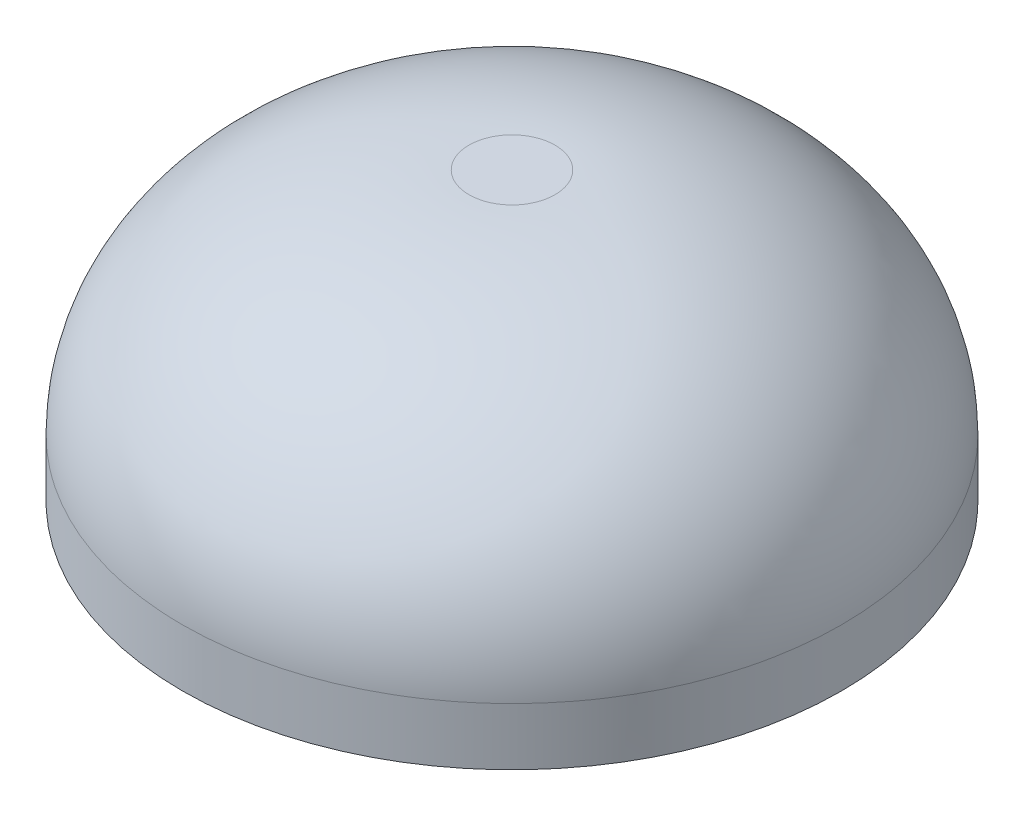
ISO-10303-21;
HEADER;
FILE_DESCRIPTION(('STEP AP214'),'2;1');
FILE_NAME('part.step','',(''),(''),'','','');
FILE_SCHEMA(('AUTOMOTIVE_DESIGN { 1 0 10303 214 1 1 1 1 }'));
ENDSEC;
DATA;
#1=APPLICATION_CONTEXT('core data for automotive mechanical design processes');
#2=APPLICATION_PROTOCOL_DEFINITION('international standard','automotive_design',2000,#1);
#3=PRODUCT_CONTEXT('',#1,'mechanical');
#4=PRODUCT('Part','Part','',(#3));
#5=PRODUCT_RELATED_PRODUCT_CATEGORY('part','',(#4));
#6=PRODUCT_DEFINITION_FORMATION('','',#4);
#7=PRODUCT_DEFINITION_CONTEXT('part definition',#1,'design');
#8=PRODUCT_DEFINITION('design','',#6,#7);
#9=PRODUCT_DEFINITION_SHAPE('','',#8);
#10=(LENGTH_UNIT() NAMED_UNIT(*) SI_UNIT(.MILLI.,.METRE.));
#11=(NAMED_UNIT(*) PLANE_ANGLE_UNIT() SI_UNIT($,.RADIAN.));
#12=(NAMED_UNIT(*) SI_UNIT($,.STERADIAN.) SOLID_ANGLE_UNIT());
#13=UNCERTAINTY_MEASURE_WITH_UNIT(LENGTH_MEASURE(1.E-05),#10,'distance_accuracy_value','');
#14=(GEOMETRIC_REPRESENTATION_CONTEXT(3) GLOBAL_UNCERTAINTY_ASSIGNED_CONTEXT((#13)) GLOBAL_UNIT_ASSIGNED_CONTEXT((#10,
#11,#12)) REPRESENTATION_CONTEXT('',''));
#15=CARTESIAN_POINT('',(0.,0.,0.));
#16=DIRECTION('',(0.,0.,1.));
#17=DIRECTION('',(1.,0.,0.));
#18=AXIS2_PLACEMENT_3D('',#15,#16,#17);
#19=CARTESIAN_POINT('',(2.95,7.,0.));
#20=DIRECTION('',(1.,0.,0.));
#21=DIRECTION('',(0.,0.,-1.));
#22=AXIS2_PLACEMENT_3D('',#19,#20,#21);
#23=PLANE('',#22);
#24=DIRECTION('',(0.,-1.,0.));
#25=VECTOR('',#24,1.);
#26=CARTESIAN_POINT('',(2.95,7.,1.7031832941094));
#27=LINE('',#26,#25);
#28=CARTESIAN_POINT('',(2.95,7.,1.7031832941094));
#29=VERTEX_POINT('',#28);
#30=CARTESIAN_POINT('',(2.95,2.5,1.7031832941094));
#31=VERTEX_POINT('',#30);
#32=EDGE_CURVE('E116',#29,#31,#27,.T.);
#33=ORIENTED_EDGE('',*,*,#32,.T.);
#34=DIRECTION('',(0.,0.,-1.));
#35=VECTOR('',#34,1.);
#36=CARTESIAN_POINT('',(2.95,2.5,0.));
#37=LINE('',#36,#35);
#38=CARTESIAN_POINT('',(2.95,2.5,-1.7031832941094));
#39=VERTEX_POINT('',#38);
#40=EDGE_CURVE('E105',#31,#39,#37,.T.);
#41=ORIENTED_EDGE('',*,*,#40,.T.);
#42=DIRECTION('',(0.,-1.,0.));
#43=VECTOR('',#42,1.);
#44=CARTESIAN_POINT('',(2.95,7.,-1.7031832941094));
#45=LINE('',#44,#43);
#46=CARTESIAN_POINT('',(2.95,7.,-1.7031832941094));
#47=VERTEX_POINT('',#46);
#48=EDGE_CURVE('E114',#47,#39,#45,.T.);
#49=ORIENTED_EDGE('',*,*,#48,.F.);
#50=DIRECTION('',(0.,0.,1.));
#51=VECTOR('',#50,1.);
#52=CARTESIAN_POINT('',(2.95,7.,0.));
#53=LINE('',#52,#51);
#54=EDGE_CURVE('E216',#47,#29,#53,.T.);
#55=ORIENTED_EDGE('',*,*,#54,.T.);
#56=EDGE_LOOP('',(#33,#41,#49,#55));
#57=FACE_BOUND('',#56,.T.);
#58=ADVANCED_FACE('F48',(#57),#23,.T.);
#59=CARTESIAN_POINT('',(1.475,7.,2.55477494116409));
#60=DIRECTION('',(0.5,0.,0.866025403784439));
#61=DIRECTION('',(0.866025403784439,0.,-0.5));
#62=AXIS2_PLACEMENT_3D('',#59,#60,#61);
#63=PLANE('',#62);
#64=DIRECTION('',(0.,-1.,0.));
#65=VECTOR('',#64,1.);
#66=CARTESIAN_POINT('',(0.,7.,3.40636658821879));
#67=LINE('',#66,#65);
#68=CARTESIAN_POINT('',(0.,7.,3.40636658821879));
#69=VERTEX_POINT('',#68);
#70=CARTESIAN_POINT('',(0.,2.5,3.40636658821879));
#71=VERTEX_POINT('',#70);
#72=EDGE_CURVE('E200',#69,#71,#67,.T.);
#73=ORIENTED_EDGE('',*,*,#72,.T.);
#74=DIRECTION('',(0.866025403784439,0.,-0.5));
#75=VECTOR('',#74,1.);
#76=CARTESIAN_POINT('',(1.475,2.5,2.55477494116409));
#77=LINE('',#76,#75);
#78=EDGE_CURVE('E119',#71,#31,#77,.T.);
#79=ORIENTED_EDGE('',*,*,#78,.T.);
#80=ORIENTED_EDGE('',*,*,#32,.F.);
#81=DIRECTION('',(-0.866025403784439,0.,0.5));
#82=VECTOR('',#81,1.);
#83=CARTESIAN_POINT('',(1.475,7.,2.55477494116409));
#84=LINE('',#83,#82);
#85=EDGE_CURVE('E75',#29,#69,#84,.T.);
#86=ORIENTED_EDGE('',*,*,#85,.T.);
#87=EDGE_LOOP('',(#73,#79,#80,#86));
#88=FACE_BOUND('',#87,.T.);
#89=ADVANCED_FACE('F250',(#88),#63,.T.);
#90=CARTESIAN_POINT('',(-1.475,7.,2.5547749411641));
#91=DIRECTION('',(-0.5,0.,0.866025403784439));
#92=DIRECTION('',(0.866025403784439,0.,0.5));
#93=AXIS2_PLACEMENT_3D('',#90,#91,#92);
#94=PLANE('',#93);
#95=DIRECTION('',(0.,-1.,0.));
#96=VECTOR('',#95,1.);
#97=CARTESIAN_POINT('',(-2.95,7.,1.7031832941094));
#98=LINE('',#97,#96);
#99=CARTESIAN_POINT('',(-2.95,7.,1.7031832941094));
#100=VERTEX_POINT('',#99);
#101=CARTESIAN_POINT('',(-2.95,2.5,1.7031832941094));
#102=VERTEX_POINT('',#101);
#103=EDGE_CURVE('E204',#100,#102,#98,.T.);
#104=ORIENTED_EDGE('',*,*,#103,.T.);
#105=DIRECTION('',(0.866025403784439,0.,0.5));
#106=VECTOR('',#105,1.);
#107=CARTESIAN_POINT('',(-1.475,2.5,2.5547749411641));
#108=LINE('',#107,#106);
#109=EDGE_CURVE('E235',#102,#71,#108,.T.);
#110=ORIENTED_EDGE('',*,*,#109,.T.);
#111=ORIENTED_EDGE('',*,*,#72,.F.);
#112=DIRECTION('',(-0.866025403784439,0.,-0.5));
#113=VECTOR('',#112,1.);
#114=CARTESIAN_POINT('',(-1.475,7.,2.5547749411641));
#115=LINE('',#114,#113);
#116=EDGE_CURVE('E220',#69,#100,#115,.T.);
#117=ORIENTED_EDGE('',*,*,#116,.T.);
#118=EDGE_LOOP('',(#104,#110,#111,#117));
#119=FACE_BOUND('',#118,.T.);
#120=ADVANCED_FACE('F253',(#119),#94,.T.);
#121=CARTESIAN_POINT('',(-2.95,7.,0.));
#122=DIRECTION('',(-1.,0.,0.));
#123=DIRECTION('',(0.,0.,1.));
#124=AXIS2_PLACEMENT_3D('',#121,#122,#123);
#125=PLANE('',#124);
#126=DIRECTION('',(0.,-1.,0.));
#127=VECTOR('',#126,1.);
#128=CARTESIAN_POINT('',(-2.95,7.,-1.7031832941094));
#129=LINE('',#128,#127);
#130=CARTESIAN_POINT('',(-2.95,7.,-1.7031832941094));
#131=VERTEX_POINT('',#130);
#132=CARTESIAN_POINT('',(-2.95,2.5,-1.7031832941094));
#133=VERTEX_POINT('',#132);
#134=EDGE_CURVE('E130',#131,#133,#129,.T.);
#135=ORIENTED_EDGE('',*,*,#134,.T.);
#136=DIRECTION('',(0.,0.,1.));
#137=VECTOR('',#136,1.);
#138=CARTESIAN_POINT('',(-2.95,2.5,0.));
#139=LINE('',#138,#137);
#140=EDGE_CURVE('E239',#133,#102,#139,.T.);
#141=ORIENTED_EDGE('',*,*,#140,.T.);
#142=ORIENTED_EDGE('',*,*,#103,.F.);
#143=DIRECTION('',(0.,0.,-1.));
#144=VECTOR('',#143,1.);
#145=CARTESIAN_POINT('',(-2.95,7.,0.));
#146=LINE('',#145,#144);
#147=EDGE_CURVE('E223',#100,#131,#146,.T.);
#148=ORIENTED_EDGE('',*,*,#147,.T.);
#149=EDGE_LOOP('',(#135,#141,#142,#148));
#150=FACE_BOUND('',#149,.T.);
#151=ADVANCED_FACE('F255',(#150),#125,.T.);
#152=CARTESIAN_POINT('',(-1.475,7.,-2.55477494116409));
#153=DIRECTION('',(-0.5,0.,-0.866025403784439));
#154=DIRECTION('',(-0.866025403784439,0.,0.5));
#155=AXIS2_PLACEMENT_3D('',#152,#153,#154);
#156=PLANE('',#155);
#157=DIRECTION('',(0.,-1.,0.));
#158=VECTOR('',#157,1.);
#159=CARTESIAN_POINT('',(0.,7.,-3.40636658821879));
#160=LINE('',#159,#158);
#161=CARTESIAN_POINT('',(0.,7.,-3.40636658821879));
#162=VERTEX_POINT('',#161);
#163=CARTESIAN_POINT('',(0.,2.5,-3.40636658821879));
#164=VERTEX_POINT('',#163);
#165=EDGE_CURVE('E125',#162,#164,#160,.T.);
#166=ORIENTED_EDGE('',*,*,#165,.T.);
#167=DIRECTION('',(-0.866025403784439,0.,0.5));
#168=VECTOR('',#167,1.);
#169=CARTESIAN_POINT('',(-1.475,2.5,-2.55477494116409));
#170=LINE('',#169,#168);
#171=EDGE_CURVE('E68',#164,#133,#170,.T.);
#172=ORIENTED_EDGE('',*,*,#171,.T.);
#173=ORIENTED_EDGE('',*,*,#134,.F.);
#174=DIRECTION('',(0.866025403784439,0.,-0.5));
#175=VECTOR('',#174,1.);
#176=CARTESIAN_POINT('',(-1.475,7.,-2.55477494116409));
#177=LINE('',#176,#175);
#178=EDGE_CURVE('E226',#131,#162,#177,.T.);
#179=ORIENTED_EDGE('',*,*,#178,.T.);
#180=EDGE_LOOP('',(#166,#172,#173,#179));
#181=FACE_BOUND('',#180,.T.);
#182=ADVANCED_FACE('F244',(#181),#156,.T.);
#183=CARTESIAN_POINT('',(1.475,7.,-2.5547749411641));
#184=DIRECTION('',(0.5,0.,-0.866025403784439));
#185=DIRECTION('',(-0.866025403784439,0.,-0.5));
#186=AXIS2_PLACEMENT_3D('',#183,#184,#185);
#187=PLANE('',#186);
#188=ORIENTED_EDGE('',*,*,#48,.T.);
#189=DIRECTION('',(-0.866025403784439,0.,-0.5));
#190=VECTOR('',#189,1.);
#191=CARTESIAN_POINT('',(1.475,2.5,-2.5547749411641));
#192=LINE('',#191,#190);
#193=EDGE_CURVE('E12',#39,#164,#192,.T.);
#194=ORIENTED_EDGE('',*,*,#193,.T.);
#195=ORIENTED_EDGE('',*,*,#165,.F.);
#196=DIRECTION('',(0.866025403784439,0.,0.5));
#197=VECTOR('',#196,1.);
#198=CARTESIAN_POINT('',(1.475,7.,-2.5547749411641));
#199=LINE('',#198,#197);
#200=EDGE_CURVE('E123',#162,#47,#199,.T.);
#201=ORIENTED_EDGE('',*,*,#200,.T.);
#202=EDGE_LOOP('',(#188,#194,#195,#201));
#203=FACE_BOUND('',#202,.T.);
#204=ADVANCED_FACE('F121',(#203),#187,.T.);
#205=CARTESIAN_POINT('',(0.,10.,0.));
#206=DIRECTION('',(0.,-1.,0.));
#207=DIRECTION('',(0.,0.,-1.));
#208=AXIS2_PLACEMENT_3D('',#205,#206,#207);
#209=CYLINDRICAL_SURFACE('',#208,11.5);
#210=CARTESIAN_POINT('',(0.,2.,11.5));
#211=CARTESIAN_POINT('',(1.50534636833816,2.,11.5));
#212=CARTESIAN_POINT('',(3.01010077315078,2.,11.2006857390137));
#213=CARTESIAN_POINT('',(5.79161817124628,2.,10.0485435087459));
#214=CARTESIAN_POINT('',(7.06728735855903,2.,9.19616860873156));
#215=CARTESIAN_POINT('',(9.19616860873156,2.,7.06728735855903));
#216=CARTESIAN_POINT('',(10.0485435087459,2.,5.79161817124626));
#217=CARTESIAN_POINT('',(11.2006857390137,2.,3.01010077315079));
#218=CARTESIAN_POINT('',(11.5,2.,1.50534636833797));
#219=CARTESIAN_POINT('',(11.5,2.,-1.50534636833796));
#220=CARTESIAN_POINT('',(11.2006857390138,2.,-3.01010077315072));
#221=CARTESIAN_POINT('',(10.0485435087458,2.,-5.79161817124636));
#222=CARTESIAN_POINT('',(9.19616860873156,2.,-7.06728735855903));
#223=CARTESIAN_POINT('',(7.06728735855902,2.,-9.19616860873157));
#224=CARTESIAN_POINT('',(5.79161817124618,2.,-10.0485435087459));
#225=CARTESIAN_POINT('',(3.01010077315091,2.,-11.2006857390137));
#226=CARTESIAN_POINT('',(1.50534636833797,2.,-11.5));
#227=CARTESIAN_POINT('',(-1.50534636833796,2.,-11.5));
#228=CARTESIAN_POINT('',(-3.01010077315102,2.,-11.2006857390136));
#229=CARTESIAN_POINT('',(-5.79161817124601,2.,-10.048543508746));
#230=CARTESIAN_POINT('',(-7.06728735855903,2.,-9.19616860873156));
#231=CARTESIAN_POINT('',(-9.19616860873157,2.,-7.06728735855902));
#232=CARTESIAN_POINT('',(-10.0485435087459,2.,-5.79161817124624));
#233=CARTESIAN_POINT('',(-11.2006857390137,2.,-3.01010077315085));
#234=CARTESIAN_POINT('',(-11.5,2.,-1.50534636833795));
#235=CARTESIAN_POINT('',(-11.5,2.,1.50534636833798));
#236=CARTESIAN_POINT('',(-11.2006857390136,2.,3.01010077315102));
#237=CARTESIAN_POINT('',(-10.048543508746,2.,5.79161817124601));
#238=CARTESIAN_POINT('',(-9.19616860873167,2.,7.06728735855891));
#239=CARTESIAN_POINT('',(-7.06728735855897,2.,9.19616860873163));
#240=CARTESIAN_POINT('',(-5.79161817124625,2.,10.0485435087459));
#241=CARTESIAN_POINT('',(-3.01010077315085,2.,11.2006857390137));
#242=CARTESIAN_POINT('',(-1.50534636833816,2.,11.5));
#243=CARTESIAN_POINT('',(0.,2.,11.5));
#244=(BOUNDED_CURVE() B_SPLINE_CURVE(3,(#210,#211,#212,#213,#214,#215,#216,#217,#218,#219,#220,
#221,#222,#223,#224,#225,#226,#227,#228,#229,#230,#231,#232,#233,#234,#235,#236,#237,#238,#239,
#240,#241,#242,#243),.UNSPECIFIED.,.T.,.F.) B_SPLINE_CURVE_WITH_KNOTS((4,2,2,2,2,2,2,2,2,2,2,2,
2,2,2,2,4),(0.,0.392699081698724,0.785398163397448,1.17809724509617,1.5707963267949,
1.96349540849362,2.35619449019234,2.74889357189107,3.14159265358979,3.53429173528852,
3.92699081698724,4.31968989868597,4.71238898038469,5.10508806208341,5.49778714378214,
5.89048622548086,6.28318530717959),
.UNSPECIFIED.) CURVE() GEOMETRIC_REPRESENTATION_ITEM() RATIONAL_B_SPLINE_CURVE((1.,1.,1.,1.,1.,
1.,1.,1.,1.,1.,1.,1.,1.,1.,1.,1.,1.,1.,1.,1.,1.,1.,1.,1.,1.,1.,1.,1.,1.,1.,1.,1.,1.,1.)) REPRESENTATION_ITEM(''));
#245=CARTESIAN_POINT('',(0.,2.,11.5));
#246=VERTEX_POINT('',#245);
#247=EDGE_CURVE('E61',#246,#246,#244,.F.);
#248=ORIENTED_EDGE('',*,*,#247,.T.);
#249=EDGE_LOOP('',(#248));
#250=FACE_BOUND('',#249,.T.);
#251=CARTESIAN_POINT('',(0.,0.,0.));
#252=DIRECTION('',(0.,1.,0.));
#253=DIRECTION('',(0.,0.,1.));
#254=AXIS2_PLACEMENT_3D('',#251,#252,#253);
#255=CIRCLE('',#254,11.5);
#256=CARTESIAN_POINT('',(0.,0.,11.5));
#257=VERTEX_POINT('',#256);
#258=EDGE_CURVE('E136',#257,#257,#255,.T.);
#259=ORIENTED_EDGE('',*,*,#258,.T.);
#260=EDGE_LOOP('',(#259));
#261=FACE_BOUND('',#260,.T.);
#262=ADVANCED_FACE('F162',(#250,#261),#209,.T.);
#263=CARTESIAN_POINT('',(0.,10.,0.));
#264=DIRECTION('',(0.,1.,0.));
#265=DIRECTION('',(0.,0.,1.));
#266=AXIS2_PLACEMENT_3D('',#263,#264,#265);
#267=PLANE('',#266);
#268=CARTESIAN_POINT('',(0.,10.,1.5));
#269=CARTESIAN_POINT('',(-0.196349526304977,10.,1.5));
#270=CARTESIAN_POINT('',(-0.392621839976202,10.,1.46095900943658));
#271=CARTESIAN_POINT('',(-0.755428457119071,10.,1.31067958809727));
#272=CARTESIAN_POINT('',(-0.921820090246833,10.,1.19950025331281));
#273=CARTESIAN_POINT('',(-1.19950025331281,10.,0.921820090246827));
#274=CARTESIAN_POINT('',(-1.31067958809732,10.,0.755428457119056));
#275=CARTESIAN_POINT('',(-1.46095900943654,10.,0.392621839976208));
#276=CARTESIAN_POINT('',(-1.5,10.,0.196349526304955));
#277=CARTESIAN_POINT('',(-1.5,10.,-0.19634952630495));
#278=CARTESIAN_POINT('',(-1.46095900943658,10.,-0.392621839976202));
#279=CARTESIAN_POINT('',(-1.31067958809727,10.,-0.755428457119071));
#280=CARTESIAN_POINT('',(-1.19950025331279,10.,-0.921820090246829));
#281=CARTESIAN_POINT('',(-0.921820090246852,10.,-1.19950025331281));
#282=CARTESIAN_POINT('',(-0.755428457119067,10.,-1.31067958809732));
#283=CARTESIAN_POINT('',(-0.392621839976198,10.,-1.46095900943654));
#284=CARTESIAN_POINT('',(-0.196349526304952,10.,-1.5));
#285=CARTESIAN_POINT('',(0.196349526304952,10.,-1.5));
#286=CARTESIAN_POINT('',(0.392621839976202,10.,-1.46095900943656));
#287=CARTESIAN_POINT('',(0.755428457119071,10.,-1.31067958809729));
#288=CARTESIAN_POINT('',(0.921820090246829,10.,-1.19950025331281));
#289=CARTESIAN_POINT('',(1.19950025331281,10.,-0.921820090246831));
#290=CARTESIAN_POINT('',(1.31067958809727,10.,-0.75542845711908));
#291=CARTESIAN_POINT('',(1.46095900943659,10.,-0.39262183997619));
#292=CARTESIAN_POINT('',(1.5,10.,-0.196349526304952));
#293=CARTESIAN_POINT('',(1.5,10.,0.196349526304952));
#294=CARTESIAN_POINT('',(1.46095900943656,10.,0.392621839976189));
#295=CARTESIAN_POINT('',(1.3106795880973,10.,0.755428457119079));
#296=CARTESIAN_POINT('',(1.19950025331281,10.,0.921820090246811));
#297=CARTESIAN_POINT('',(0.921820090246832,10.,1.19950025331283));
#298=CARTESIAN_POINT('',(0.755428457119064,10.,1.31067958809728));
#299=CARTESIAN_POINT('',(0.392621839976205,10.,1.46095900943658));
#300=CARTESIAN_POINT('',(0.196349526304977,10.,1.5));
#301=CARTESIAN_POINT('',(0.,10.,1.5));
#302=(BOUNDED_CURVE() B_SPLINE_CURVE(3,(#268,#269,#270,#271,#272,#273,#274,#275,#276,#277,#278,
#279,#280,#281,#282,#283,#284,#285,#286,#287,#288,#289,#290,#291,#292,#293,#294,#295,#296,#297,
#298,#299,#300,#301),.UNSPECIFIED.,.T.,.F.) B_SPLINE_CURVE_WITH_KNOTS((4,2,2,2,2,2,2,2,2,2,2,2,
2,2,2,2,4),(0.,0.392699081698725,0.785398163397448,1.17809724509617,1.5707963267949,
1.96349540849362,2.35619449019234,2.74889357189107,3.14159265358979,3.53429173528852,
3.92699081698724,4.31968989868597,4.71238898038469,5.10508806208341,5.49778714378214,
5.89048622548086,6.28318530717959),
.UNSPECIFIED.) CURVE() GEOMETRIC_REPRESENTATION_ITEM() RATIONAL_B_SPLINE_CURVE((1.,1.,1.,1.,1.,
1.,1.,1.,1.,1.,1.,1.,1.,1.,1.,1.,1.,1.,1.,1.,1.,1.,1.,1.,1.,1.,1.,1.,1.,1.,1.,1.,1.,1.)) REPRESENTATION_ITEM(''));
#303=CARTESIAN_POINT('',(0.,10.,1.5));
#304=VERTEX_POINT('',#303);
#305=EDGE_CURVE('E140',#304,#304,#302,.F.);
#306=ORIENTED_EDGE('',*,*,#305,.T.);
#307=EDGE_LOOP('',(#306));
#308=FACE_BOUND('',#307,.T.);
#309=ADVANCED_FACE('F151',(#308),#267,.T.);
#310=CARTESIAN_POINT('',(0.,0.,0.));
#311=DIRECTION('',(0.,1.,0.));
#312=DIRECTION('',(0.,0.,1.));
#313=AXIS2_PLACEMENT_3D('',#310,#311,#312);
#314=PLANE('',#313);
#315=CARTESIAN_POINT('',(0.,0.,0.));
#316=DIRECTION('',(0.,-1.,0.));
#317=DIRECTION('',(0.,0.,-1.));
#318=AXIS2_PLACEMENT_3D('',#315,#316,#317);
#319=CIRCLE('',#318,7.);
#320=CARTESIAN_POINT('',(0.,0.,-7.));
#321=VERTEX_POINT('',#320);
#322=EDGE_CURVE('E118',#321,#321,#319,.T.);
#323=ORIENTED_EDGE('',*,*,#322,.F.);
#324=EDGE_LOOP('',(#323));
#325=FACE_BOUND('',#324,.T.);
#326=ORIENTED_EDGE('',*,*,#258,.F.);
#327=EDGE_LOOP('',(#326));
#328=FACE_BOUND('',#327,.T.);
#329=ADVANCED_FACE('F161',(#325,#328),#314,.F.);
#330=CARTESIAN_POINT('',(0.,10.,1.5));
#331=CARTESIAN_POINT('',(0.196349526304977,10.,1.5));
#332=CARTESIAN_POINT('',(0.392621839976205,10.,1.46095900943658));
#333=CARTESIAN_POINT('',(0.755428457119064,10.,1.31067958809728));
#334=CARTESIAN_POINT('',(0.921820090246832,10.,1.19950025331283));
#335=CARTESIAN_POINT('',(1.19950025331281,10.,0.921820090246811));
#336=CARTESIAN_POINT('',(1.3106795880973,10.,0.755428457119079));
#337=CARTESIAN_POINT('',(1.46095900943656,10.,0.392621839976189));
#338=CARTESIAN_POINT('',(1.5,10.,0.196349526304952));
#339=CARTESIAN_POINT('',(1.5,10.,-0.196349526304952));
#340=CARTESIAN_POINT('',(1.46095900943659,10.,-0.39262183997619));
#341=CARTESIAN_POINT('',(1.31067958809727,10.,-0.75542845711908));
#342=CARTESIAN_POINT('',(1.19950025331281,10.,-0.921820090246831));
#343=CARTESIAN_POINT('',(0.921820090246829,10.,-1.19950025331281));
#344=CARTESIAN_POINT('',(0.755428457119071,10.,-1.31067958809729));
#345=CARTESIAN_POINT('',(0.392621839976202,10.,-1.46095900943656));
#346=CARTESIAN_POINT('',(0.196349526304952,10.,-1.5));
#347=CARTESIAN_POINT('',(-0.196349526304952,10.,-1.5));
#348=CARTESIAN_POINT('',(-0.392621839976198,10.,-1.46095900943654));
#349=CARTESIAN_POINT('',(-0.755428457119067,10.,-1.31067958809732));
#350=CARTESIAN_POINT('',(-0.921820090246852,10.,-1.19950025331281));
#351=CARTESIAN_POINT('',(-1.19950025331279,10.,-0.921820090246829));
#352=CARTESIAN_POINT('',(-1.31067958809727,10.,-0.755428457119071));
#353=CARTESIAN_POINT('',(-1.46095900943658,10.,-0.392621839976202));
#354=CARTESIAN_POINT('',(-1.5,10.,-0.19634952630495));
#355=CARTESIAN_POINT('',(-1.5,10.,0.196349526304955));
#356=CARTESIAN_POINT('',(-1.46095900943654,10.,0.392621839976208));
#357=CARTESIAN_POINT('',(-1.31067958809732,10.,0.755428457119056));
#358=CARTESIAN_POINT('',(-1.19950025331281,10.,0.921820090246827));
#359=CARTESIAN_POINT('',(-0.921820090246833,10.,1.19950025331281));
#360=CARTESIAN_POINT('',(-0.755428457119071,10.,1.31067958809727));
#361=CARTESIAN_POINT('',(-0.392621839976202,10.,1.46095900943658));
#362=CARTESIAN_POINT('',(-0.196349526304977,10.,1.5));
#363=CARTESIAN_POINT('',(0.,10.,1.5));
#364=CARTESIAN_POINT('',(0.,10.,11.5));
#365=CARTESIAN_POINT('',(1.50534636833816,9.99999999999949,11.4999999999995));
#366=CARTESIAN_POINT('',(3.01010077315104,10.,11.2006857390143));
#367=CARTESIAN_POINT('',(5.79161817124602,10.,10.0485435087453));
#368=CARTESIAN_POINT('',(7.06728735855903,10.,9.19616860873156));
#369=CARTESIAN_POINT('',(9.19616860873156,10.,7.06728735855903));
#370=CARTESIAN_POINT('',(10.0485435087457,10.,5.79161817124614));
#371=CARTESIAN_POINT('',(11.2006857390139,10.,3.01010077315092));
#372=CARTESIAN_POINT('',(11.5,10.,1.50534636833797));
#373=CARTESIAN_POINT('',(11.5,10.,-1.50534636833796));
#374=CARTESIAN_POINT('',(11.2006857390139,10.,-3.01010077315076));
#375=CARTESIAN_POINT('',(10.0485435087457,10.,-5.79161817124631));
#376=CARTESIAN_POINT('',(9.19616860873139,10.,-7.06728735855903));
#377=CARTESIAN_POINT('',(7.06728735855919,10.,-9.19616860873158));
#378=CARTESIAN_POINT('',(5.79161817124607,10.,-10.0485435087461));
#379=CARTESIAN_POINT('',(3.01010077315103,10.,-11.2006857390135));
#380=CARTESIAN_POINT('',(1.50534636833797,10.,-11.5));
#381=CARTESIAN_POINT('',(-1.50534636833796,10.,-11.5));
#382=CARTESIAN_POINT('',(-3.01010077315083,10.,-11.2006857390135));
#383=CARTESIAN_POINT('',(-5.79161817124621,10.,-10.0485435087461));
#384=CARTESIAN_POINT('',(-7.06728735855903,10.,-9.19616860873139));
#385=CARTESIAN_POINT('',(-9.19616860873157,10.,-7.06728735855919));
#386=CARTESIAN_POINT('',(-10.0485435087459,10.,-5.79161817124615));
#387=CARTESIAN_POINT('',(-11.2006857390137,10.,-3.01010077315094));
#388=CARTESIAN_POINT('',(-11.5000000000002,10.,-1.50534636833795));
#389=CARTESIAN_POINT('',(-11.4999999999998,10.,1.50534636833798));
#390=CARTESIAN_POINT('',(-11.2006857390135,10.,3.01010077315091));
#391=CARTESIAN_POINT('',(-10.0485435087461,10.,5.79161817124612));
#392=CARTESIAN_POINT('',(-9.19616860873176,10.,7.06728735855883));
#393=CARTESIAN_POINT('',(-7.06728735855888,10.,9.19616860873171));
#394=CARTESIAN_POINT('',(-5.79161817124616,10.,10.0485435087459));
#395=CARTESIAN_POINT('',(-3.01010077315094,10.,11.2006857390137));
#396=CARTESIAN_POINT('',(-1.50534636833816,10.0000000000005,11.5000000000005));
#397=CARTESIAN_POINT('',(0.,10.,11.5));
#398=CARTESIAN_POINT('',(0.,2.,11.5));
#399=CARTESIAN_POINT('',(1.50534636833816,2.,11.5));
#400=CARTESIAN_POINT('',(3.01010077315078,2.,11.2006857390137));
#401=CARTESIAN_POINT('',(5.79161817124628,2.,10.0485435087459));
#402=CARTESIAN_POINT('',(7.06728735855903,2.,9.19616860873156));
#403=CARTESIAN_POINT('',(9.19616860873156,2.,7.06728735855903));
#404=CARTESIAN_POINT('',(10.0485435087459,2.,5.79161817124626));
#405=CARTESIAN_POINT('',(11.2006857390137,2.,3.01010077315079));
#406=CARTESIAN_POINT('',(11.5,2.,1.50534636833797));
#407=CARTESIAN_POINT('',(11.5,2.,-1.50534636833796));
#408=CARTESIAN_POINT('',(11.2006857390138,2.,-3.01010077315072));
#409=CARTESIAN_POINT('',(10.0485435087458,2.,-5.79161817124636));
#410=CARTESIAN_POINT('',(9.19616860873156,2.,-7.06728735855903));
#411=CARTESIAN_POINT('',(7.06728735855902,2.,-9.19616860873157));
#412=CARTESIAN_POINT('',(5.79161817124618,2.,-10.0485435087459));
#413=CARTESIAN_POINT('',(3.01010077315091,2.,-11.2006857390137));
#414=CARTESIAN_POINT('',(1.50534636833797,2.,-11.5));
#415=CARTESIAN_POINT('',(-1.50534636833796,2.,-11.5));
#416=CARTESIAN_POINT('',(-3.01010077315102,2.,-11.2006857390136));
#417=CARTESIAN_POINT('',(-5.79161817124601,2.,-10.048543508746));
#418=CARTESIAN_POINT('',(-7.06728735855903,2.,-9.19616860873156));
#419=CARTESIAN_POINT('',(-9.19616860873157,2.,-7.06728735855902));
#420=CARTESIAN_POINT('',(-10.0485435087459,2.,-5.79161817124624));
#421=CARTESIAN_POINT('',(-11.2006857390137,2.,-3.01010077315085));
#422=CARTESIAN_POINT('',(-11.5,2.,-1.50534636833795));
#423=CARTESIAN_POINT('',(-11.5,2.,1.50534636833798));
#424=CARTESIAN_POINT('',(-11.2006857390136,2.,3.01010077315102));
#425=CARTESIAN_POINT('',(-10.048543508746,2.,5.79161817124601));
#426=CARTESIAN_POINT('',(-9.19616860873167,2.,7.06728735855891));
#427=CARTESIAN_POINT('',(-7.06728735855897,2.,9.19616860873163));
#428=CARTESIAN_POINT('',(-5.79161817124625,2.,10.0485435087459));
#429=CARTESIAN_POINT('',(-3.01010077315085,2.,11.2006857390137));
#430=CARTESIAN_POINT('',(-1.50534636833816,2.,11.5));
#431=CARTESIAN_POINT('',(0.,2.,11.5));
#432=(BOUNDED_SURFACE() B_SPLINE_SURFACE(2,3,((#330,#331,#332,#333,#334,#335,#336,#337,#338,
#339,#340,#341,#342,#343,#344,#345,#346,#347,#348,#349,#350,#351,#352,#353,#354,#355,#356,#357,
#358,#359,#360,#361,#362,#363),(#364,#365,#366,#367,#368,#369,#370,#371,#372,#373,#374,#375,
#376,#377,#378,#379,#380,#381,#382,#383,#384,#385,#386,#387,#388,#389,#390,#391,#392,#393,#394,
#395,#396,#397),(#398,#399,#400,#401,#402,#403,#404,#405,#406,#407,#408,#409,#410,#411,#412,
#413,#414,#415,#416,#417,#418,#419,#420,#421,#422,#423,#424,#425,#426,#427,#428,#429,#430,
#431)),.UNSPECIFIED.,.F.,.T.,.F.) B_SPLINE_SURFACE_WITH_KNOTS((3,3),(4,2,2,2,2,2,2,2,2,2,2,2,2,
2,2,2,4),(0.,1.),(0.,0.392699081698724,0.785398163397448,1.17809724509617,1.5707963267949,
1.96349540849362,2.35619449019234,2.74889357189107,3.14159265358979,3.53429173528852,
3.92699081698724,4.31968989868597,4.71238898038469,5.10508806208341,5.49778714378214,
5.89048622548086,6.28318530717959),
.UNSPECIFIED.) GEOMETRIC_REPRESENTATION_ITEM() RATIONAL_B_SPLINE_SURFACE(((1.,1.,1.,1.,1.,1.,1.,
1.,1.,1.,1.,1.,1.,1.,1.,1.,1.,1.,1.,1.,1.,1.,1.,1.,1.,1.,1.,1.,1.,1.,1.,1.,1.,1.),
(0.707106781186548,0.707106781186548,0.707106781186548,0.707106781186548,0.707106781186548,
0.707106781186548,0.707106781186548,0.707106781186548,0.707106781186548,0.707106781186548,
0.707106781186548,0.707106781186548,0.707106781186548,0.707106781186548,0.707106781186548,
0.707106781186548,0.707106781186548,0.707106781186548,0.707106781186548,0.707106781186548,
0.707106781186548,0.707106781186548,0.707106781186548,0.707106781186548,0.707106781186548,
0.707106781186548,0.707106781186548,0.707106781186548,0.707106781186548,0.707106781186548,
0.707106781186548,0.707106781186548,0.707106781186548,0.707106781186548),(1.,1.,1.,1.,1.,1.,1.,
1.,1.,1.,1.,1.,1.,1.,1.,1.,1.,1.,1.,1.,1.,1.,1.,1.,1.,1.,1.,1.,1.,1.,1.,1.,1.,1.))) REPRESENTATION_ITEM('') SURFACE());
#433=ORIENTED_EDGE('',*,*,#247,.F.);
#434=EDGE_LOOP('',(#433));
#435=FACE_BOUND('',#434,.T.);
#436=ORIENTED_EDGE('',*,*,#305,.F.);
#437=EDGE_LOOP('',(#436));
#438=FACE_BOUND('',#437,.T.);
#439=ADVANCED_FACE('F51',(#435,#438),#432,.T.);
#440=CARTESIAN_POINT('',(0.,7.,0.));
#441=DIRECTION('',(0.,-1.,0.));
#442=DIRECTION('',(0.,0.,-1.));
#443=AXIS2_PLACEMENT_3D('',#440,#441,#442);
#444=CYLINDRICAL_SURFACE('',#443,7.);
#445=CARTESIAN_POINT('',(0.,7.,0.));
#446=DIRECTION('',(0.,-1.,0.));
#447=DIRECTION('',(0.,0.,-1.));
#448=AXIS2_PLACEMENT_3D('',#445,#446,#447);
#449=CIRCLE('',#448,7.);
#450=CARTESIAN_POINT('',(0.,7.,-7.));
#451=VERTEX_POINT('',#450);
#452=EDGE_CURVE('E126',#451,#451,#449,.T.);
#453=ORIENTED_EDGE('',*,*,#452,.F.);
#454=EDGE_LOOP('',(#453));
#455=FACE_BOUND('',#454,.T.);
#456=ORIENTED_EDGE('',*,*,#322,.T.);
#457=EDGE_LOOP('',(#456));
#458=FACE_BOUND('',#457,.T.);
#459=ADVANCED_FACE('F272',(#455,#458),#444,.F.);
#460=CARTESIAN_POINT('',(0.,7.,0.));
#461=DIRECTION('',(0.,-1.,0.));
#462=DIRECTION('',(0.,0.,-1.));
#463=AXIS2_PLACEMENT_3D('',#460,#461,#462);
#464=PLANE('',#463);
#465=ORIENTED_EDGE('',*,*,#54,.F.);
#466=ORIENTED_EDGE('',*,*,#200,.F.);
#467=ORIENTED_EDGE('',*,*,#178,.F.);
#468=ORIENTED_EDGE('',*,*,#147,.F.);
#469=ORIENTED_EDGE('',*,*,#116,.F.);
#470=ORIENTED_EDGE('',*,*,#85,.F.);
#471=EDGE_LOOP('',(#465,#466,#467,#468,#469,#470));
#472=FACE_BOUND('',#471,.T.);
#473=ORIENTED_EDGE('',*,*,#452,.T.);
#474=EDGE_LOOP('',(#473));
#475=FACE_BOUND('',#474,.T.);
#476=ADVANCED_FACE('F246',(#472,#475),#464,.T.);
#477=CARTESIAN_POINT('',(0.,2.5,0.));
#478=DIRECTION('',(0.,-1.,0.));
#479=DIRECTION('',(0.,0.,-1.));
#480=AXIS2_PLACEMENT_3D('',#477,#478,#479);
#481=PLANE('',#480);
#482=ORIENTED_EDGE('',*,*,#78,.F.);
#483=ORIENTED_EDGE('',*,*,#109,.F.);
#484=ORIENTED_EDGE('',*,*,#140,.F.);
#485=ORIENTED_EDGE('',*,*,#171,.F.);
#486=ORIENTED_EDGE('',*,*,#193,.F.);
#487=ORIENTED_EDGE('',*,*,#40,.F.);
#488=EDGE_LOOP('',(#482,#483,#484,#485,#486,#487));
#489=FACE_BOUND('',#488,.T.);
#490=ADVANCED_FACE('F104',(#489),#481,.T.);
#491=CLOSED_SHELL('',(#58,#89,#120,#151,#182,#204,#262,#309,#329,#439,#459,#476,#490));
#492=MANIFOLD_SOLID_BREP('B2',#491);
#493=ADVANCED_BREP_SHAPE_REPRESENTATION('',(#18,#492),#14);
#494=SHAPE_DEFINITION_REPRESENTATION(#9,#493);
ENDSEC;
END-ISO-10303-21;
